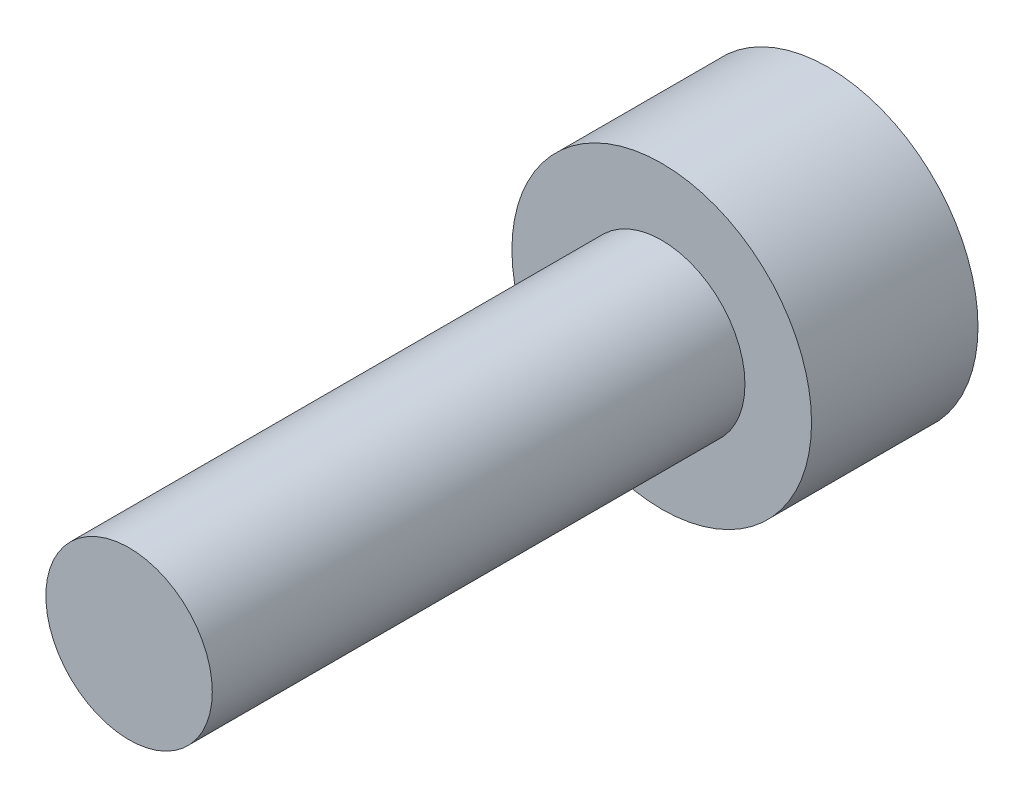
ISO-10303-21;
HEADER;
FILE_DESCRIPTION(('STEP AP214'),'2;1');
FILE_NAME('part.step','',(''),(''),'','','');
FILE_SCHEMA(('AUTOMOTIVE_DESIGN { 1 0 10303 214 1 1 1 1 }'));
ENDSEC;
DATA;
#1=APPLICATION_CONTEXT('core data for automotive mechanical design processes');
#2=APPLICATION_PROTOCOL_DEFINITION('international standard','automotive_design',2000,#1);
#3=PRODUCT_CONTEXT('',#1,'mechanical');
#4=PRODUCT('Part','Part','',(#3));
#5=PRODUCT_RELATED_PRODUCT_CATEGORY('part','',(#4));
#6=PRODUCT_DEFINITION_FORMATION('','',#4);
#7=PRODUCT_DEFINITION_CONTEXT('part definition',#1,'design');
#8=PRODUCT_DEFINITION('design','',#6,#7);
#9=PRODUCT_DEFINITION_SHAPE('','',#8);
#10=(LENGTH_UNIT() NAMED_UNIT(*) SI_UNIT(.MILLI.,.METRE.));
#11=(NAMED_UNIT(*) PLANE_ANGLE_UNIT() SI_UNIT($,.RADIAN.));
#12=(NAMED_UNIT(*) SI_UNIT($,.STERADIAN.) SOLID_ANGLE_UNIT());
#13=UNCERTAINTY_MEASURE_WITH_UNIT(LENGTH_MEASURE(1.E-05),#10,'distance_accuracy_value','');
#14=(GEOMETRIC_REPRESENTATION_CONTEXT(3) GLOBAL_UNCERTAINTY_ASSIGNED_CONTEXT((#13)) GLOBAL_UNIT_ASSIGNED_CONTEXT((#10,
#11,#12)) REPRESENTATION_CONTEXT('',''));
#15=CARTESIAN_POINT('',(0.,0.,0.));
#16=DIRECTION('',(0.,0.,1.));
#17=DIRECTION('',(1.,0.,0.));
#18=AXIS2_PLACEMENT_3D('',#15,#16,#17);
#19=CARTESIAN_POINT('',(0.,0.,-2.5));
#20=DIRECTION('',(0.,0.,1.));
#21=DIRECTION('',(1.,0.,0.));
#22=AXIS2_PLACEMENT_3D('',#19,#20,#21);
#23=PLANE('',#22);
#24=CARTESIAN_POINT('',(0.,0.,-2.5));
#25=DIRECTION('',(0.,0.,1.));
#26=DIRECTION('',(1.,0.,0.));
#27=AXIS2_PLACEMENT_3D('',#24,#25,#26);
#28=CIRCLE('',#27,2.25);
#29=CARTESIAN_POINT('',(2.25,0.,-2.5));
#30=VERTEX_POINT('',#29);
#31=EDGE_CURVE('E50',#30,#30,#28,.T.);
#32=ORIENTED_EDGE('',*,*,#31,.F.);
#33=EDGE_LOOP('',(#32));
#34=FACE_BOUND('',#33,.T.);
#35=DIRECTION('',(0.866025403784441,-0.499999999999995,0.));
#36=VECTOR('',#35,1.);
#37=CARTESIAN_POINT('',(-0.999999999999993,-0.577350269189637,-2.5));
#38=LINE('',#37,#36);
#39=CARTESIAN_POINT('',(-0.999999999999993,-0.577350269189637,-2.5));
#40=VERTEX_POINT('',#39);
#41=CARTESIAN_POINT('',(0.,-1.15470053837925,-2.5));
#42=VERTEX_POINT('',#41);
#43=EDGE_CURVE('E64',#40,#42,#38,.T.);
#44=ORIENTED_EDGE('',*,*,#43,.T.);
#45=DIRECTION('',(0.866025403784438,0.500000000000001,0.));
#46=VECTOR('',#45,1.);
#47=CARTESIAN_POINT('',(0.,-1.15470053837925,-2.5));
#48=LINE('',#47,#46);
#49=CARTESIAN_POINT('',(1.,-0.577350269189624,-2.5));
#50=VERTEX_POINT('',#49);
#51=EDGE_CURVE('E136',#42,#50,#48,.T.);
#52=ORIENTED_EDGE('',*,*,#51,.T.);
#53=DIRECTION('',(0.,1.,0.));
#54=VECTOR('',#53,1.);
#55=CARTESIAN_POINT('',(1.,-0.577350269189624,-2.5));
#56=LINE('',#55,#54);
#57=CARTESIAN_POINT('',(0.999999999999998,0.57735026918963,-2.5));
#58=VERTEX_POINT('',#57);
#59=EDGE_CURVE('E141',#50,#58,#56,.T.);
#60=ORIENTED_EDGE('',*,*,#59,.T.);
#61=DIRECTION('',(-0.866025403784442,0.499999999999995,0.));
#62=VECTOR('',#61,1.);
#63=CARTESIAN_POINT('',(0.999999999999998,0.57735026918963,-2.5));
#64=LINE('',#63,#62);
#65=CARTESIAN_POINT('',(0.,1.15470053837925,-2.5));
#66=VERTEX_POINT('',#65);
#67=EDGE_CURVE('E150',#58,#66,#64,.T.);
#68=ORIENTED_EDGE('',*,*,#67,.T.);
#69=DIRECTION('',(-0.866025403784434,-0.500000000000007,0.));
#70=VECTOR('',#69,1.);
#71=CARTESIAN_POINT('',(0.,1.15470053837925,-2.5));
#72=LINE('',#71,#70);
#73=CARTESIAN_POINT('',(-1.00000000000001,0.577350269189617,-2.5));
#74=VERTEX_POINT('',#73);
#75=EDGE_CURVE('E125',#66,#74,#72,.T.);
#76=ORIENTED_EDGE('',*,*,#75,.T.);
#77=DIRECTION('',(0.,-1.,0.));
#78=VECTOR('',#77,1.);
#79=CARTESIAN_POINT('',(-1.00000000000001,0.577350269189617,-2.5));
#80=LINE('',#79,#78);
#81=EDGE_CURVE('E151',#74,#40,#80,.T.);
#82=ORIENTED_EDGE('',*,*,#81,.T.);
#83=EDGE_LOOP('',(#44,#52,#60,#68,#76,#82));
#84=FACE_BOUND('',#83,.T.);
#85=ADVANCED_FACE('F43',(#34,#84),#23,.F.);
#86=CARTESIAN_POINT('',(0.,0.,0.));
#87=DIRECTION('',(0.,0.,-1.));
#88=DIRECTION('',(-1.,0.,0.));
#89=AXIS2_PLACEMENT_3D('',#86,#87,#88);
#90=CYLINDRICAL_SURFACE('',#89,2.25);
#91=CARTESIAN_POINT('',(0.,0.,0.));
#92=DIRECTION('',(0.,0.,1.));
#93=DIRECTION('',(1.,0.,0.));
#94=AXIS2_PLACEMENT_3D('',#91,#92,#93);
#95=CIRCLE('',#94,2.25);
#96=CARTESIAN_POINT('',(2.25,0.,0.));
#97=VERTEX_POINT('',#96);
#98=EDGE_CURVE('E52',#97,#97,#95,.T.);
#99=ORIENTED_EDGE('',*,*,#98,.F.);
#100=EDGE_LOOP('',(#99));
#101=FACE_BOUND('',#100,.T.);
#102=ORIENTED_EDGE('',*,*,#31,.T.);
#103=EDGE_LOOP('',(#102));
#104=FACE_BOUND('',#103,.T.);
#105=ADVANCED_FACE('F44',(#101,#104),#90,.T.);
#106=CARTESIAN_POINT('',(0.,0.,0.));
#107=DIRECTION('',(0.,0.,1.));
#108=DIRECTION('',(1.,0.,0.));
#109=AXIS2_PLACEMENT_3D('',#106,#107,#108);
#110=PLANE('',#109);
#111=CARTESIAN_POINT('',(0.,0.,0.));
#112=DIRECTION('',(0.,0.,1.));
#113=DIRECTION('',(1.,0.,0.));
#114=AXIS2_PLACEMENT_3D('',#111,#112,#113);
#115=CIRCLE('',#114,1.25);
#116=CARTESIAN_POINT('',(1.25,0.,0.));
#117=VERTEX_POINT('',#116);
#118=EDGE_CURVE('E11',#117,#117,#115,.T.);
#119=ORIENTED_EDGE('',*,*,#118,.F.);
#120=EDGE_LOOP('',(#119));
#121=FACE_BOUND('',#120,.T.);
#122=ORIENTED_EDGE('',*,*,#98,.T.);
#123=EDGE_LOOP('',(#122));
#124=FACE_BOUND('',#123,.T.);
#125=ADVANCED_FACE('F211',(#121,#124),#110,.T.);
#126=CARTESIAN_POINT('',(0.,0.,8.));
#127=DIRECTION('',(0.,0.,-1.));
#128=DIRECTION('',(-1.,0.,0.));
#129=AXIS2_PLACEMENT_3D('',#126,#127,#128);
#130=CYLINDRICAL_SURFACE('',#129,1.25);
#131=CARTESIAN_POINT('',(0.,0.,8.));
#132=DIRECTION('',(0.,0.,1.));
#133=DIRECTION('',(1.,0.,0.));
#134=AXIS2_PLACEMENT_3D('',#131,#132,#133);
#135=CIRCLE('',#134,1.25);
#136=CARTESIAN_POINT('',(1.25,0.,8.));
#137=VERTEX_POINT('',#136);
#138=EDGE_CURVE('E169',#137,#137,#135,.T.);
#139=ORIENTED_EDGE('',*,*,#138,.F.);
#140=EDGE_LOOP('',(#139));
#141=FACE_BOUND('',#140,.T.);
#142=ORIENTED_EDGE('',*,*,#118,.T.);
#143=EDGE_LOOP('',(#142));
#144=FACE_BOUND('',#143,.T.);
#145=ADVANCED_FACE('F210',(#141,#144),#130,.T.);
#146=CARTESIAN_POINT('',(0.,0.,8.));
#147=DIRECTION('',(0.,0.,1.));
#148=DIRECTION('',(1.,0.,0.));
#149=AXIS2_PLACEMENT_3D('',#146,#147,#148);
#150=PLANE('',#149);
#151=ORIENTED_EDGE('',*,*,#138,.T.);
#152=EDGE_LOOP('',(#151));
#153=FACE_BOUND('',#152,.T.);
#154=ADVANCED_FACE('F203',(#153),#150,.T.);
#155=CARTESIAN_POINT('',(-0.999999999999993,-0.577350269189637,-1.25));
#156=DIRECTION('',(0.499999999999995,0.866025403784441,0.));
#157=DIRECTION('',(-0.866025403784441,0.499999999999995,0.));
#158=AXIS2_PLACEMENT_3D('',#155,#156,#157);
#159=PLANE('',#158);
#160=ORIENTED_EDGE('',*,*,#43,.F.);
#161=DIRECTION('',(0.,0.,-1.));
#162=VECTOR('',#161,1.);
#163=CARTESIAN_POINT('',(-0.999999999999993,-0.577350269189637,-1.25));
#164=LINE('',#163,#162);
#165=CARTESIAN_POINT('',(-0.999999999999993,-0.577350269189637,-1.25));
#166=VERTEX_POINT('',#165);
#167=EDGE_CURVE('E135',#166,#40,#164,.T.);
#168=ORIENTED_EDGE('',*,*,#167,.F.);
#169=DIRECTION('',(0.866025403784441,-0.499999999999995,0.));
#170=VECTOR('',#169,1.);
#171=CARTESIAN_POINT('',(-0.999999999999993,-0.577350269189637,-1.25));
#172=LINE('',#171,#170);
#173=CARTESIAN_POINT('',(0.,-1.15470053837925,-1.25));
#174=VERTEX_POINT('',#173);
#175=EDGE_CURVE('E154',#166,#174,#172,.T.);
#176=ORIENTED_EDGE('',*,*,#175,.T.);
#177=DIRECTION('',(0.,0.,-1.));
#178=VECTOR('',#177,1.);
#179=CARTESIAN_POINT('',(0.,-1.15470053837925,-1.25));
#180=LINE('',#179,#178);
#181=EDGE_CURVE('E164',#174,#42,#180,.T.);
#182=ORIENTED_EDGE('',*,*,#181,.T.);
#183=EDGE_LOOP('',(#160,#168,#176,#182));
#184=FACE_BOUND('',#183,.T.);
#185=ADVANCED_FACE('F185',(#184),#159,.T.);
#186=CARTESIAN_POINT('',(0.,-1.15470053837925,-1.25));
#187=DIRECTION('',(-0.500000000000001,0.866025403784438,0.));
#188=DIRECTION('',(-0.866025403784438,-0.500000000000001,0.));
#189=AXIS2_PLACEMENT_3D('',#186,#187,#188);
#190=PLANE('',#189);
#191=ORIENTED_EDGE('',*,*,#51,.F.);
#192=ORIENTED_EDGE('',*,*,#181,.F.);
#193=DIRECTION('',(0.866025403784438,0.500000000000001,0.));
#194=VECTOR('',#193,1.);
#195=CARTESIAN_POINT('',(0.,-1.15470053837925,-1.25));
#196=LINE('',#195,#194);
#197=CARTESIAN_POINT('',(1.,-0.577350269189624,-1.25));
#198=VERTEX_POINT('',#197);
#199=EDGE_CURVE('E99',#174,#198,#196,.T.);
#200=ORIENTED_EDGE('',*,*,#199,.T.);
#201=DIRECTION('',(0.,0.,-1.));
#202=VECTOR('',#201,1.);
#203=CARTESIAN_POINT('',(1.,-0.577350269189624,-1.25));
#204=LINE('',#203,#202);
#205=EDGE_CURVE('E165',#198,#50,#204,.T.);
#206=ORIENTED_EDGE('',*,*,#205,.T.);
#207=EDGE_LOOP('',(#191,#192,#200,#206));
#208=FACE_BOUND('',#207,.T.);
#209=ADVANCED_FACE('F191',(#208),#190,.T.);
#210=CARTESIAN_POINT('',(1.,-0.577350269189624,-1.25));
#211=DIRECTION('',(-1.,0.,0.));
#212=DIRECTION('',(0.,-1.,0.));
#213=AXIS2_PLACEMENT_3D('',#210,#211,#212);
#214=PLANE('',#213);
#215=ORIENTED_EDGE('',*,*,#59,.F.);
#216=ORIENTED_EDGE('',*,*,#205,.F.);
#217=DIRECTION('',(0.,1.,0.));
#218=VECTOR('',#217,1.);
#219=CARTESIAN_POINT('',(1.,-0.577350269189624,-1.25));
#220=LINE('',#219,#218);
#221=CARTESIAN_POINT('',(0.999999999999998,0.57735026918963,-1.25));
#222=VERTEX_POINT('',#221);
#223=EDGE_CURVE('E118',#198,#222,#220,.T.);
#224=ORIENTED_EDGE('',*,*,#223,.T.);
#225=DIRECTION('',(0.,0.,-1.));
#226=VECTOR('',#225,1.);
#227=CARTESIAN_POINT('',(0.999999999999998,0.57735026918963,-1.25));
#228=LINE('',#227,#226);
#229=EDGE_CURVE('E113',#222,#58,#228,.T.);
#230=ORIENTED_EDGE('',*,*,#229,.T.);
#231=EDGE_LOOP('',(#215,#216,#224,#230));
#232=FACE_BOUND('',#231,.T.);
#233=ADVANCED_FACE('F194',(#232),#214,.T.);
#234=CARTESIAN_POINT('',(0.999999999999998,0.57735026918963,-1.25));
#235=DIRECTION('',(-0.499999999999995,-0.866025403784442,0.));
#236=DIRECTION('',(0.866025403784442,-0.499999999999995,0.));
#237=AXIS2_PLACEMENT_3D('',#234,#235,#236);
#238=PLANE('',#237);
#239=ORIENTED_EDGE('',*,*,#67,.F.);
#240=ORIENTED_EDGE('',*,*,#229,.F.);
#241=DIRECTION('',(-0.866025403784442,0.499999999999995,0.));
#242=VECTOR('',#241,1.);
#243=CARTESIAN_POINT('',(0.999999999999998,0.57735026918963,-1.25));
#244=LINE('',#243,#242);
#245=CARTESIAN_POINT('',(0.,1.15470053837925,-1.25));
#246=VERTEX_POINT('',#245);
#247=EDGE_CURVE('E109',#222,#246,#244,.T.);
#248=ORIENTED_EDGE('',*,*,#247,.T.);
#249=DIRECTION('',(0.,0.,-1.));
#250=VECTOR('',#249,1.);
#251=CARTESIAN_POINT('',(0.,1.15470053837925,-1.25));
#252=LINE('',#251,#250);
#253=EDGE_CURVE('E111',#246,#66,#252,.T.);
#254=ORIENTED_EDGE('',*,*,#253,.T.);
#255=EDGE_LOOP('',(#239,#240,#248,#254));
#256=FACE_BOUND('',#255,.T.);
#257=ADVANCED_FACE('F114',(#256),#238,.T.);
#258=CARTESIAN_POINT('',(0.,1.15470053837925,-1.25));
#259=DIRECTION('',(0.500000000000007,-0.866025403784435,0.));
#260=DIRECTION('',(0.866025403784435,0.500000000000007,0.));
#261=AXIS2_PLACEMENT_3D('',#258,#259,#260);
#262=PLANE('',#261);
#263=ORIENTED_EDGE('',*,*,#75,.F.);
#264=ORIENTED_EDGE('',*,*,#253,.F.);
#265=DIRECTION('',(-0.866025403784434,-0.500000000000007,0.));
#266=VECTOR('',#265,1.);
#267=CARTESIAN_POINT('',(0.,1.15470053837925,-1.25));
#268=LINE('',#267,#266);
#269=CARTESIAN_POINT('',(-1.00000000000001,0.577350269189617,-1.25));
#270=VERTEX_POINT('',#269);
#271=EDGE_CURVE('E120',#246,#270,#268,.T.);
#272=ORIENTED_EDGE('',*,*,#271,.T.);
#273=DIRECTION('',(0.,0.,-1.));
#274=VECTOR('',#273,1.);
#275=CARTESIAN_POINT('',(-1.00000000000001,0.577350269189617,-1.25));
#276=LINE('',#275,#274);
#277=EDGE_CURVE('E93',#270,#74,#276,.T.);
#278=ORIENTED_EDGE('',*,*,#277,.T.);
#279=EDGE_LOOP('',(#263,#264,#272,#278));
#280=FACE_BOUND('',#279,.T.);
#281=ADVANCED_FACE('F122',(#280),#262,.T.);
#282=CARTESIAN_POINT('',(-1.00000000000001,0.577350269189617,-1.25));
#283=DIRECTION('',(1.,0.,0.));
#284=DIRECTION('',(0.,1.,0.));
#285=AXIS2_PLACEMENT_3D('',#282,#283,#284);
#286=PLANE('',#285);
#287=ORIENTED_EDGE('',*,*,#81,.F.);
#288=ORIENTED_EDGE('',*,*,#277,.F.);
#289=DIRECTION('',(0.,-1.,0.));
#290=VECTOR('',#289,1.);
#291=CARTESIAN_POINT('',(-1.00000000000001,0.577350269189617,-1.25));
#292=LINE('',#291,#290);
#293=EDGE_CURVE('E66',#270,#166,#292,.T.);
#294=ORIENTED_EDGE('',*,*,#293,.T.);
#295=ORIENTED_EDGE('',*,*,#167,.T.);
#296=EDGE_LOOP('',(#287,#288,#294,#295));
#297=FACE_BOUND('',#296,.T.);
#298=ADVANCED_FACE('F182',(#297),#286,.T.);
#299=CARTESIAN_POINT('',(0.,0.,-1.25));
#300=DIRECTION('',(0.,0.,1.));
#301=DIRECTION('',(1.,0.,0.));
#302=AXIS2_PLACEMENT_3D('',#299,#300,#301);
#303=PLANE('',#302);
#304=ORIENTED_EDGE('',*,*,#175,.F.);
#305=ORIENTED_EDGE('',*,*,#293,.F.);
#306=ORIENTED_EDGE('',*,*,#271,.F.);
#307=ORIENTED_EDGE('',*,*,#247,.F.);
#308=ORIENTED_EDGE('',*,*,#223,.F.);
#309=ORIENTED_EDGE('',*,*,#199,.F.);
#310=EDGE_LOOP('',(#304,#305,#306,#307,#308,#309));
#311=FACE_BOUND('',#310,.T.);
#312=ADVANCED_FACE('F130',(#311),#303,.F.);
#313=CLOSED_SHELL('',(#85,#105,#125,#145,#154,#185,#209,#233,#257,#281,#298,#312));
#314=MANIFOLD_SOLID_BREP('B2',#313);
#315=ADVANCED_BREP_SHAPE_REPRESENTATION('',(#18,#314),#14);
#316=SHAPE_DEFINITION_REPRESENTATION(#9,#315);
ENDSEC;
END-ISO-10303-21;
